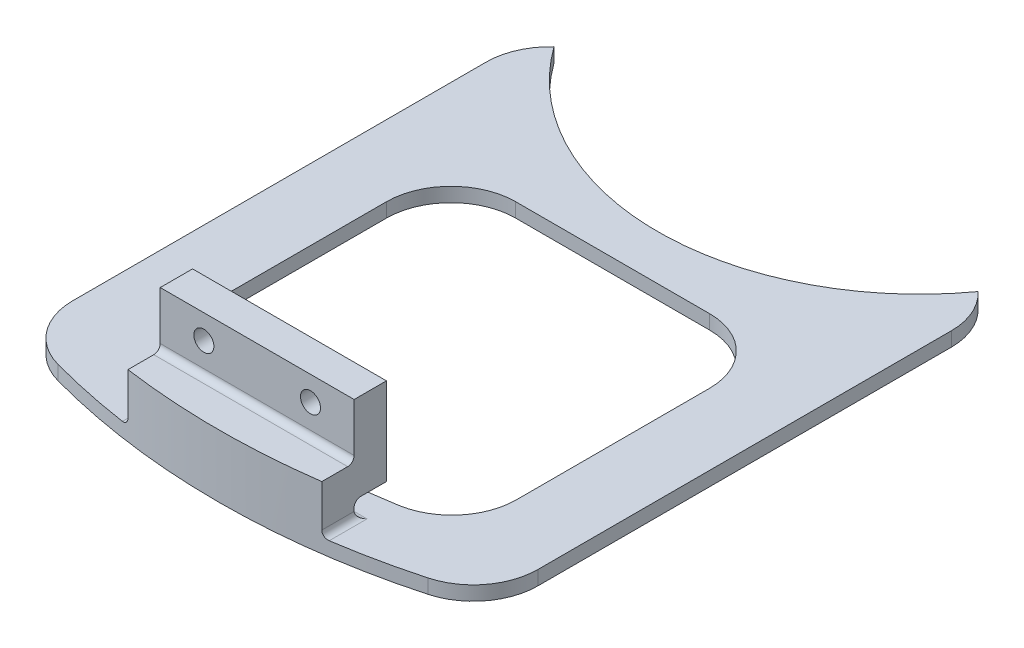
ISO-10303-21;
HEADER;
FILE_DESCRIPTION(('STEP AP214'),'2;1');
FILE_NAME('part.step','',(''),(''),'','','');
FILE_SCHEMA(('AUTOMOTIVE_DESIGN { 1 0 10303 214 1 1 1 1 }'));
ENDSEC;
DATA;
#1=APPLICATION_CONTEXT('core data for automotive mechanical design processes');
#2=APPLICATION_PROTOCOL_DEFINITION('international standard','automotive_design',2000,#1);
#3=PRODUCT_CONTEXT('',#1,'mechanical');
#4=PRODUCT('Part','Part','',(#3));
#5=PRODUCT_RELATED_PRODUCT_CATEGORY('part','',(#4));
#6=PRODUCT_DEFINITION_FORMATION('','',#4);
#7=PRODUCT_DEFINITION_CONTEXT('part definition',#1,'design');
#8=PRODUCT_DEFINITION('design','',#6,#7);
#9=PRODUCT_DEFINITION_SHAPE('','',#8);
#10=(LENGTH_UNIT() NAMED_UNIT(*) SI_UNIT(.MILLI.,.METRE.));
#11=(NAMED_UNIT(*) PLANE_ANGLE_UNIT() SI_UNIT($,.RADIAN.));
#12=(NAMED_UNIT(*) SI_UNIT($,.STERADIAN.) SOLID_ANGLE_UNIT());
#13=UNCERTAINTY_MEASURE_WITH_UNIT(LENGTH_MEASURE(1.E-05),#10,'distance_accuracy_value','');
#14=(GEOMETRIC_REPRESENTATION_CONTEXT(3) GLOBAL_UNCERTAINTY_ASSIGNED_CONTEXT((#13)) GLOBAL_UNIT_ASSIGNED_CONTEXT((#10,
#11,#12)) REPRESENTATION_CONTEXT('',''));
#15=CARTESIAN_POINT('',(0.,0.,0.));
#16=DIRECTION('',(0.,0.,1.));
#17=DIRECTION('',(1.,0.,0.));
#18=AXIS2_PLACEMENT_3D('',#15,#16,#17);
#19=CARTESIAN_POINT('',(8.25,-9.25,-97.48));
#20=DIRECTION('',(0.,-1.,0.));
#21=DIRECTION('',(0.,0.,-1.));
#22=AXIS2_PLACEMENT_3D('',#19,#20,#21);
#23=CYLINDRICAL_SURFACE('',#22,108.521658667752);
#24=CARTESIAN_POINT('',(8.25,-9.25,-97.48));
#25=DIRECTION('',(0.,-1.,0.));
#26=DIRECTION('',(0.,0.,-1.));
#27=AXIS2_PLACEMENT_3D('',#24,#25,#26);
#28=CIRCLE('',#27,108.521658667752);
#29=CARTESIAN_POINT('',(-7.75,-9.25,9.85569024327362));
#30=VERTEX_POINT('',#29);
#31=CARTESIAN_POINT('',(-20.3875682307191,-9.25,7.19492577418382));
#32=VERTEX_POINT('',#31);
#33=EDGE_CURVE('E268',#30,#32,#28,.T.);
#34=ORIENTED_EDGE('',*,*,#33,.T.);
#35=DIRECTION('',(0.,-1.,0.));
#36=VECTOR('',#35,1.);
#37=CARTESIAN_POINT('',(-20.3875682307191,-9.25,7.19492577418385));
#38=LINE('',#37,#36);
#39=CARTESIAN_POINT('',(-20.3875682307191,-11.45,7.19492577418382));
#40=VERTEX_POINT('',#39);
#41=EDGE_CURVE('E429',#32,#40,#38,.T.);
#42=ORIENTED_EDGE('',*,*,#41,.T.);
#43=CARTESIAN_POINT('',(8.25,-11.45,-97.48));
#44=DIRECTION('',(0.,-1.,0.));
#45=DIRECTION('',(0.,0.,-1.));
#46=AXIS2_PLACEMENT_3D('',#43,#44,#45);
#47=CIRCLE('',#46,108.521658667752);
#48=CARTESIAN_POINT('',(36.887568230719,-11.45,7.19492577418385));
#49=VERTEX_POINT('',#48);
#50=EDGE_CURVE('E258',#49,#40,#47,.T.);
#51=ORIENTED_EDGE('',*,*,#50,.F.);
#52=DIRECTION('',(0.,-1.,0.));
#53=VECTOR('',#52,1.);
#54=CARTESIAN_POINT('',(36.887568230719,-9.25,7.19492577418385));
#55=LINE('',#54,#53);
#56=CARTESIAN_POINT('',(36.887568230719,-9.25,7.19492577418385));
#57=VERTEX_POINT('',#56);
#58=EDGE_CURVE('E427',#49,#57,#55,.F.);
#59=ORIENTED_EDGE('',*,*,#58,.T.);
#60=CARTESIAN_POINT('',(24.25,-9.25,9.85569024327364));
#61=VERTEX_POINT('',#60);
#62=EDGE_CURVE('E265',#57,#61,#28,.T.);
#63=ORIENTED_EDGE('',*,*,#62,.T.);
#64=CARTESIAN_POINT('',(24.25,-9.25,9.85569024327364));
#65=CARTESIAN_POINT('',(24.2216633227259,-9.24999964339574,9.8599143150362));
#66=CARTESIAN_POINT('',(24.1933383876985,-9.24879480217106,9.86412502392636));
#67=CARTESIAN_POINT('',(24.1368858122979,-9.24398621382035,9.87249448224565));
#68=CARTESIAN_POINT('',(24.1087581679046,-9.24038251572121,9.8766532327349));
#69=CARTESIAN_POINT('',(24.0250038254511,-9.22600081021664,9.88900309035678));
#70=CARTESIAN_POINT('',(23.9699300760957,-9.21165212940956,9.89707907575636));
#71=CARTESIAN_POINT('',(23.8629333855757,-9.17379976489967,9.91268897203966));
#72=CARTESIAN_POINT('',(23.8110124046851,-9.15029045148022,9.92022254620202));
#73=CARTESIAN_POINT('',(23.7118390084713,-9.09475414414218,9.93454484704541));
#74=CARTESIAN_POINT('',(23.664585300504,-9.06272951774119,9.94133378001955));
#75=CARTESIAN_POINT('',(23.5763773146324,-8.9912411869201,9.9539543036151));
#76=CARTESIAN_POINT('',(23.5353899379214,-8.95181920628776,9.95979093613669));
#77=CARTESIAN_POINT('',(23.4606143267098,-8.86651187037467,9.97040270678705));
#78=CARTESIAN_POINT('',(23.4268273713199,-8.82062536911251,9.97517765632089));
#79=CARTESIAN_POINT('',(23.3677761168279,-8.72418227142505,9.98350138184809));
#80=CARTESIAN_POINT('',(23.342432608048,-8.67367509381844,9.98706156195158));
#81=CARTESIAN_POINT('',(23.3005987139787,-8.56906802196801,9.99292834865943));
#82=CARTESIAN_POINT('',(23.2841018986807,-8.51497076931056,9.99523586574712));
#83=CARTESIAN_POINT('',(23.2648712972298,-8.42540918819503,9.99792375532438));
#84=CARTESIAN_POINT('',(23.259297802299,-8.39054067073665,9.99870209165019));
#85=CARTESIAN_POINT('',(23.2518629545497,-8.32045332014802,9.9997400084942));
#86=CARTESIAN_POINT('',(23.2499962744671,-8.28523506296323,10.0000003334756));
#87=CARTESIAN_POINT('',(23.25,-8.25,9.99999999999993));
#88=B_SPLINE_CURVE_WITH_KNOTS('',3,(#64,#65,#66,#67,#68,#69,#70,#71,#72,#73,#74,#75,#76,#77,#78,
#79,#80,#81,#82,#83,#84,#85,#86,#87),.UNSPECIFIED.,.F.,.F.,(4,2,2,2,2,2,2,2,2,2,2,4),(0.,
0.0858969513590906,0.171792147244589,0.343356011096066,0.515025477166277,0.686647263688091,
0.857328652532093,1.02804033664651,1.19710221555896,1.3660410487506,1.47181520081828,
1.57743722879529),.UNSPECIFIED.);
#89=CARTESIAN_POINT('',(23.25,-8.25,9.99999999999994));
#90=VERTEX_POINT('',#89);
#91=EDGE_CURVE('E254',#61,#90,#88,.T.);
#92=ORIENTED_EDGE('',*,*,#91,.T.);
#93=DIRECTION('',(0.,-1.,0.));
#94=VECTOR('',#93,1.);
#95=CARTESIAN_POINT('',(23.25,6.75,9.99999999999994));
#96=LINE('',#95,#94);
#97=CARTESIAN_POINT('',(23.25,-1.75,9.99999999999994));
#98=VERTEX_POINT('',#97);
#99=EDGE_CURVE('E246',#98,#90,#96,.T.);
#100=ORIENTED_EDGE('',*,*,#99,.F.);
#101=CARTESIAN_POINT('',(8.25,-1.75,-97.48));
#102=DIRECTION('',(0.,1.,0.));
#103=DIRECTION('',(0.,0.,1.));
#104=AXIS2_PLACEMENT_3D('',#101,#102,#103);
#105=CIRCLE('',#104,108.521658667752);
#106=CARTESIAN_POINT('',(-6.75,-1.75,9.99999999999994));
#107=VERTEX_POINT('',#106);
#108=EDGE_CURVE('E228',#107,#98,#105,.T.);
#109=ORIENTED_EDGE('',*,*,#108,.F.);
#110=DIRECTION('',(0.,-1.,0.));
#111=VECTOR('',#110,1.);
#112=CARTESIAN_POINT('',(-6.74999999999996,6.75,9.99999999999994));
#113=LINE('',#112,#111);
#114=CARTESIAN_POINT('',(-6.74999999999996,-8.25,9.99999999999994));
#115=VERTEX_POINT('',#114);
#116=EDGE_CURVE('E255',#107,#115,#113,.T.);
#117=ORIENTED_EDGE('',*,*,#116,.T.);
#118=CARTESIAN_POINT('',(-6.75,-8.25,9.99999999999994));
#119=CARTESIAN_POINT('',(-6.75000004412875,-8.27793471444524,9.99999993044697));
#120=CARTESIAN_POINT('',(-6.75117126927285,-8.30585598158707,9.99983654352313));
#121=CARTESIAN_POINT('',(-6.75584280917468,-8.36149728666654,9.99918444907749));
#122=CARTESIAN_POINT('',(-6.75934297019445,-8.38921733776479,9.99869576302937));
#123=CARTESIAN_POINT('',(-6.77329941928926,-8.47171473536714,9.99674617627901));
#124=CARTESIAN_POINT('',(-6.78721179104062,-8.52593716949309,9.99480173440927));
#125=CARTESIAN_POINT('',(-6.82384495046801,-8.63124877844802,9.98966984349903));
#126=CARTESIAN_POINT('',(-6.84656918925215,-8.68233671658209,9.98648190744956));
#127=CARTESIAN_POINT('',(-6.90015101140964,-8.7799573889968,9.97894124478609));
#128=CARTESIAN_POINT('',(-6.93100775086069,-8.82649059524234,9.97458863903098));
#129=CARTESIAN_POINT('',(-7.0000923866286,-8.91389373158154,9.96480583292145));
#130=CARTESIAN_POINT('',(-7.03834952022752,-8.9547400552399,9.95937135577042));
#131=CARTESIAN_POINT('',(-7.12105559887953,-9.02944502935275,9.94756997709562));
#132=CARTESIAN_POINT('',(-7.16550582912279,-9.06330222579659,9.94120288202105));
#133=CARTESIAN_POINT('',(-7.25976332392058,-9.12339688667354,9.9276344000384));
#134=CARTESIAN_POINT('',(-7.30961672027741,-9.14956027529432,9.92042578027308));
#135=CARTESIAN_POINT('',(-7.41291592279116,-9.19314005613772,9.90540954264948));
#136=CARTESIAN_POINT('',(-7.46636017779476,-9.21056019800932,9.89760218322698));
#137=CARTESIAN_POINT('',(-7.55839251930446,-9.23223140365304,9.88408416918581));
#138=CARTESIAN_POINT('',(-7.59644659984373,-9.23889124899092,9.87847433747389));
#139=CARTESIAN_POINT('',(-7.67299677992648,-9.24777521555385,9.86714754349608));
#140=CARTESIAN_POINT('',(-7.71149216767686,-9.25000568138885,9.86143074632082));
#141=CARTESIAN_POINT('',(-7.75,-9.25,9.85569024327364));
#142=B_SPLINE_CURVE_WITH_KNOTS('',3,(#118,#119,#120,#121,#122,#123,#124,#125,#126,#127,#128,
#129,#130,#131,#132,#133,#134,#135,#136,#137,#138,#139,#140,#141),.UNSPECIFIED.,.F.,.F.,(4,2,2,
2,2,2,2,2,2,2,2,4),(0.,0.0837524462378463,0.167499364348996,0.334673806111854,0.501913786847974,
0.669136419658965,0.837033726521106,1.00496592743846,1.17446567822654,1.34389267471377,
1.46076557126968,1.57747093886661),.UNSPECIFIED.);
#143=EDGE_CURVE('E348',#115,#30,#142,.T.);
#144=ORIENTED_EDGE('',*,*,#143,.T.);
#145=EDGE_LOOP('',(#34,#42,#51,#59,#63,#92,#100,#109,#117,#144));
#146=FACE_BOUND('',#145,.T.);
#147=ADVANCED_FACE('F41',(#146),#23,.T.);
#148=CARTESIAN_POINT('',(-6.75,6.75,5.));
#149=DIRECTION('',(0.,0.,1.));
#150=DIRECTION('',(1.,0.,0.));
#151=AXIS2_PLACEMENT_3D('',#148,#149,#150);
#152=PLANE('',#151);
#153=DIRECTION('',(0.,-1.,0.));
#154=VECTOR('',#153,1.);
#155=CARTESIAN_POINT('',(-6.75,6.75,5.));
#156=LINE('',#155,#154);
#157=CARTESIAN_POINT('',(-6.75,-7.75,5.));
#158=VERTEX_POINT('',#157);
#159=CARTESIAN_POINT('',(-6.75,-8.25,5.));
#160=VERTEX_POINT('',#159);
#161=EDGE_CURVE('E261',#158,#160,#156,.T.);
#162=ORIENTED_EDGE('',*,*,#161,.F.);
#163=DIRECTION('',(-1.,0.,0.));
#164=VECTOR('',#163,1.);
#165=CARTESIAN_POINT('',(23.25,-7.75,5.));
#166=LINE('',#165,#164);
#167=CARTESIAN_POINT('',(23.25,-7.75,5.));
#168=VERTEX_POINT('',#167);
#169=EDGE_CURVE('E320',#158,#168,#166,.F.);
#170=ORIENTED_EDGE('',*,*,#169,.T.);
#171=DIRECTION('',(0.,-1.,0.));
#172=VECTOR('',#171,1.);
#173=CARTESIAN_POINT('',(23.25,6.75,5.));
#174=LINE('',#173,#172);
#175=CARTESIAN_POINT('',(23.25,-8.25,5.));
#176=VERTEX_POINT('',#175);
#177=EDGE_CURVE('E256',#168,#176,#174,.T.);
#178=ORIENTED_EDGE('',*,*,#177,.T.);
#179=DIRECTION('',(-1.,0.,0.));
#180=VECTOR('',#179,1.);
#181=CARTESIAN_POINT('',(-6.75,-8.25,5.));
#182=LINE('',#181,#180);
#183=EDGE_CURVE('E318',#176,#160,#182,.T.);
#184=ORIENTED_EDGE('',*,*,#183,.T.);
#185=EDGE_LOOP('',(#162,#170,#178,#184));
#186=FACE_BOUND('',#185,.T.);
#187=ADVANCED_FACE('F362',(#186),#152,.F.);
#188=CARTESIAN_POINT('',(8.25,-9.25,-97.48));
#189=DIRECTION('',(0.,-1.,0.));
#190=DIRECTION('',(0.,0.,-1.));
#191=AXIS2_PLACEMENT_3D('',#188,#189,#190);
#192=PLANE('',#191);
#193=DIRECTION('',(0.,0.,-1.));
#194=VECTOR('',#193,1.);
#195=CARTESIAN_POINT('',(33.25,-9.25,-2.07376121028556));
#196=LINE('',#195,#194);
#197=CARTESIAN_POINT('',(33.25,-9.25,-10.131251972072));
#198=VERTEX_POINT('',#197);
#199=CARTESIAN_POINT('',(33.25,-9.25,-40.));
#200=VERTEX_POINT('',#199);
#201=EDGE_CURVE('E477',#198,#200,#196,.T.);
#202=ORIENTED_EDGE('',*,*,#201,.F.);
#203=CARTESIAN_POINT('',(23.25,-9.25,-10.131251972072));
#204=DIRECTION('',(0.,-1.,0.));
#205=DIRECTION('',(0.,0.,-1.));
#206=AXIS2_PLACEMENT_3D('',#203,#204,#205);
#207=CIRCLE('',#206,10.);
#208=CARTESIAN_POINT('',(24.942480169274,-9.25,-0.275517048860321));
#209=VERTEX_POINT('',#208);
#210=EDGE_CURVE('E467',#198,#209,#207,.T.);
#211=ORIENTED_EDGE('',*,*,#210,.T.);
#212=CARTESIAN_POINT('',(8.25,-9.25,-97.48));
#213=DIRECTION('',(0.,1.,0.));
#214=DIRECTION('',(0.,0.,1.));
#215=AXIS2_PLACEMENT_3D('',#212,#213,#214);
#216=CIRCLE('',#215,98.6273308976777);
#217=CARTESIAN_POINT('',(-8.44248016927394,-9.25,-0.275517048860321));
#218=VERTEX_POINT('',#217);
#219=EDGE_CURVE('E310',#218,#209,#216,.T.);
#220=ORIENTED_EDGE('',*,*,#219,.F.);
#221=CARTESIAN_POINT('',(-6.74999999999999,-9.25,-10.131251972072));
#222=DIRECTION('',(0.,-1.,0.));
#223=DIRECTION('',(0.,0.,-1.));
#224=AXIS2_PLACEMENT_3D('',#221,#222,#223);
#225=CIRCLE('',#224,10.);
#226=CARTESIAN_POINT('',(-16.75,-9.25,-10.131251972072));
#227=VERTEX_POINT('',#226);
#228=EDGE_CURVE('E471',#218,#227,#225,.T.);
#229=ORIENTED_EDGE('',*,*,#228,.T.);
#230=DIRECTION('',(0.,0.,1.));
#231=VECTOR('',#230,1.);
#232=CARTESIAN_POINT('',(-16.75,-9.25,-50.));
#233=LINE('',#232,#231);
#234=CARTESIAN_POINT('',(-16.75,-9.25,-40.));
#235=VERTEX_POINT('',#234);
#236=EDGE_CURVE('E511',#235,#227,#233,.T.);
#237=ORIENTED_EDGE('',*,*,#236,.F.);
#238=CARTESIAN_POINT('',(-6.75,-9.25,-40.));
#239=DIRECTION('',(0.,-1.,0.));
#240=DIRECTION('',(0.,0.,-1.));
#241=AXIS2_PLACEMENT_3D('',#238,#239,#240);
#242=CIRCLE('',#241,10.);
#243=CARTESIAN_POINT('',(-6.75,-9.25,-50.));
#244=VERTEX_POINT('',#243);
#245=EDGE_CURVE('E64',#235,#244,#242,.T.);
#246=ORIENTED_EDGE('',*,*,#245,.T.);
#247=DIRECTION('',(-1.,0.,0.));
#248=VECTOR('',#247,1.);
#249=CARTESIAN_POINT('',(33.25,-9.25,-50.));
#250=LINE('',#249,#248);
#251=CARTESIAN_POINT('',(23.25,-9.25,-50.));
#252=VERTEX_POINT('',#251);
#253=EDGE_CURVE('E478',#252,#244,#250,.T.);
#254=ORIENTED_EDGE('',*,*,#253,.F.);
#255=CARTESIAN_POINT('',(23.25,-9.25,-40.));
#256=DIRECTION('',(0.,-1.,0.));
#257=DIRECTION('',(0.,0.,-1.));
#258=AXIS2_PLACEMENT_3D('',#255,#256,#257);
#259=CIRCLE('',#258,10.);
#260=EDGE_CURVE('E49',#252,#200,#259,.T.);
#261=ORIENTED_EDGE('',*,*,#260,.T.);
#262=EDGE_LOOP('',(#202,#211,#220,#229,#237,#246,#254,#261));
#263=FACE_BOUND('',#262,.T.);
#264=DIRECTION('',(0.,0.,-1.));
#265=VECTOR('',#264,1.);
#266=CARTESIAN_POINT('',(-27.748687791341,-9.25,4.89697435117693));
#267=LINE('',#266,#265);
#268=CARTESIAN_POINT('',(-27.748687791341,-9.25,-2.45060739027463));
#269=VERTEX_POINT('',#268);
#270=CARTESIAN_POINT('',(-27.748687791341,-9.25,-66.4009079535447));
#271=VERTEX_POINT('',#270);
#272=EDGE_CURVE('E267',#269,#271,#267,.T.);
#273=ORIENTED_EDGE('',*,*,#272,.F.);
#274=CARTESIAN_POINT('',(-17.748687791341,-9.25,-2.45060739027463));
#275=DIRECTION('',(0.,-1.,0.));
#276=DIRECTION('',(0.,0.,-1.));
#277=AXIS2_PLACEMENT_3D('',#274,#275,#276);
#278=CIRCLE('',#277,10.);
#279=EDGE_CURVE('E439',#269,#32,#278,.F.);
#280=ORIENTED_EDGE('',*,*,#279,.T.);
#281=ORIENTED_EDGE('',*,*,#33,.F.);
#282=DIRECTION('',(0.,0.,1.));
#283=VECTOR('',#282,1.);
#284=CARTESIAN_POINT('',(-7.75,-9.25,5.));
#285=LINE('',#284,#283);
#286=CARTESIAN_POINT('',(-7.75,-9.25,4.));
#287=VERTEX_POINT('',#286);
#288=EDGE_CURVE('E326',#30,#287,#285,.F.);
#289=ORIENTED_EDGE('',*,*,#288,.T.);
#290=DIRECTION('',(-1.,0.,0.));
#291=VECTOR('',#290,1.);
#292=CARTESIAN_POINT('',(23.25,-9.25,4.));
#293=LINE('',#292,#291);
#294=CARTESIAN_POINT('',(24.25,-9.25,4.));
#295=VERTEX_POINT('',#294);
#296=EDGE_CURVE('E324',#287,#295,#293,.F.);
#297=ORIENTED_EDGE('',*,*,#296,.T.);
#298=DIRECTION('',(0.,0.,-1.));
#299=VECTOR('',#298,1.);
#300=CARTESIAN_POINT('',(24.25,-9.25,9.99999999999994));
#301=LINE('',#300,#299);
#302=EDGE_CURVE('E328',#295,#61,#301,.F.);
#303=ORIENTED_EDGE('',*,*,#302,.T.);
#304=ORIENTED_EDGE('',*,*,#62,.F.);
#305=CARTESIAN_POINT('',(34.248687791341,-9.25,-2.45060739027461));
#306=DIRECTION('',(0.,-1.,0.));
#307=DIRECTION('',(0.,0.,-1.));
#308=AXIS2_PLACEMENT_3D('',#305,#306,#307);
#309=CIRCLE('',#308,10.);
#310=CARTESIAN_POINT('',(44.248687791341,-9.25,-2.4506073902746));
#311=VERTEX_POINT('',#310);
#312=EDGE_CURVE('E56',#57,#311,#309,.F.);
#313=ORIENTED_EDGE('',*,*,#312,.T.);
#314=DIRECTION('',(0.,0.,1.));
#315=VECTOR('',#314,1.);
#316=CARTESIAN_POINT('',(44.248687791341,-9.25,-66.4009079535447));
#317=LINE('',#316,#315);
#318=CARTESIAN_POINT('',(44.2486877913411,-9.25,-66.4009079535447));
#319=VERTEX_POINT('',#318);
#320=EDGE_CURVE('E279',#319,#311,#317,.T.);
#321=ORIENTED_EDGE('',*,*,#320,.F.);
#322=CARTESIAN_POINT('',(34.2486877913411,-9.25,-66.4009079535447));
#323=DIRECTION('',(0.,-1.,0.));
#324=DIRECTION('',(0.,0.,-1.));
#325=AXIS2_PLACEMENT_3D('',#322,#323,#324);
#326=CIRCLE('',#325,10.);
#327=CARTESIAN_POINT('',(41.0539523687772,-9.25,-73.7281430412905));
#328=VERTEX_POINT('',#327);
#329=EDGE_CURVE('E276',#328,#319,#326,.T.);
#330=ORIENTED_EDGE('',*,*,#329,.F.);
#331=CARTESIAN_POINT('',(8.25,-9.25,-97.48));
#332=DIRECTION('',(0.,1.,0.));
#333=DIRECTION('',(0.,0.,1.));
#334=AXIS2_PLACEMENT_3D('',#331,#332,#333);
#335=CIRCLE('',#334,40.5);
#336=CARTESIAN_POINT('',(-24.5539523687772,-9.25,-73.7281430412905));
#337=VERTEX_POINT('',#336);
#338=EDGE_CURVE('E273',#337,#328,#335,.T.);
#339=ORIENTED_EDGE('',*,*,#338,.F.);
#340=CARTESIAN_POINT('',(-17.748687791341,-9.25,-66.4009079535447));
#341=DIRECTION('',(0.,-1.,0.));
#342=DIRECTION('',(0.,0.,-1.));
#343=AXIS2_PLACEMENT_3D('',#340,#341,#342);
#344=CIRCLE('',#343,9.99999999999999);
#345=EDGE_CURVE('E270',#271,#337,#344,.T.);
#346=ORIENTED_EDGE('',*,*,#345,.F.);
#347=EDGE_LOOP('',(#273,#280,#281,#289,#297,#303,#304,#313,#321,#330,#339,#346));
#348=FACE_BOUND('',#347,.T.);
#349=ADVANCED_FACE('F476',(#263,#348),#192,.F.);
#350=CARTESIAN_POINT('',(44.248687791341,-9.25,-66.4009079535447));
#351=DIRECTION('',(1.,0.,0.));
#352=DIRECTION('',(0.,0.,-1.));
#353=AXIS2_PLACEMENT_3D('',#350,#351,#352);
#354=PLANE('',#353);
#355=ORIENTED_EDGE('',*,*,#320,.T.);
#356=DIRECTION('',(0.,-1.,0.));
#357=VECTOR('',#356,1.);
#358=CARTESIAN_POINT('',(44.248687791341,-9.25,-2.4506073902746));
#359=LINE('',#358,#357);
#360=CARTESIAN_POINT('',(44.248687791341,-11.45,-2.4506073902746));
#361=VERTEX_POINT('',#360);
#362=EDGE_CURVE('E441',#311,#361,#359,.T.);
#363=ORIENTED_EDGE('',*,*,#362,.T.);
#364=DIRECTION('',(0.,0.,1.));
#365=VECTOR('',#364,1.);
#366=CARTESIAN_POINT('',(44.248687791341,-11.45,-66.4009079535447));
#367=LINE('',#366,#365);
#368=CARTESIAN_POINT('',(44.2486877913411,-11.45,-66.4009079535447));
#369=VERTEX_POINT('',#368);
#370=EDGE_CURVE('E295',#369,#361,#367,.T.);
#371=ORIENTED_EDGE('',*,*,#370,.F.);
#372=DIRECTION('',(0.,-1.,0.));
#373=VECTOR('',#372,1.);
#374=CARTESIAN_POINT('',(44.2486877913411,-9.25,-66.4009079535447));
#375=LINE('',#374,#373);
#376=EDGE_CURVE('E298',#319,#369,#375,.T.);
#377=ORIENTED_EDGE('',*,*,#376,.F.);
#378=EDGE_LOOP('',(#355,#363,#371,#377));
#379=FACE_BOUND('',#378,.T.);
#380=ADVANCED_FACE('F557',(#379),#354,.T.);
#381=CARTESIAN_POINT('',(34.2486877913411,-9.25,-66.4009079535447));
#382=DIRECTION('',(0.,-1.,0.));
#383=DIRECTION('',(0.,0.,-1.));
#384=AXIS2_PLACEMENT_3D('',#381,#382,#383);
#385=CYLINDRICAL_SURFACE('',#384,10.);
#386=CARTESIAN_POINT('',(34.2486877913411,-11.45,-66.4009079535447));
#387=DIRECTION('',(0.,-1.,0.));
#388=DIRECTION('',(0.,0.,-1.));
#389=AXIS2_PLACEMENT_3D('',#386,#387,#388);
#390=CIRCLE('',#389,10.);
#391=CARTESIAN_POINT('',(41.0539523687772,-11.45,-73.7281430412905));
#392=VERTEX_POINT('',#391);
#393=EDGE_CURVE('E292',#392,#369,#390,.T.);
#394=ORIENTED_EDGE('',*,*,#393,.F.);
#395=DIRECTION('',(0.,-1.,0.));
#396=VECTOR('',#395,1.);
#397=CARTESIAN_POINT('',(41.0539523687772,-9.25,-73.7281430412905));
#398=LINE('',#397,#396);
#399=EDGE_CURVE('E301',#328,#392,#398,.T.);
#400=ORIENTED_EDGE('',*,*,#399,.F.);
#401=ORIENTED_EDGE('',*,*,#329,.T.);
#402=ORIENTED_EDGE('',*,*,#376,.T.);
#403=EDGE_LOOP('',(#394,#400,#401,#402));
#404=FACE_BOUND('',#403,.T.);
#405=ADVANCED_FACE('F570',(#404),#385,.T.);
#406=CARTESIAN_POINT('',(8.25,-9.25,-97.48));
#407=DIRECTION('',(0.,-1.,0.));
#408=DIRECTION('',(0.,0.,-1.));
#409=AXIS2_PLACEMENT_3D('',#406,#407,#408);
#410=CYLINDRICAL_SURFACE('',#409,40.5);
#411=CARTESIAN_POINT('',(8.25,-11.45,-97.48));
#412=DIRECTION('',(0.,1.,0.));
#413=DIRECTION('',(0.,0.,1.));
#414=AXIS2_PLACEMENT_3D('',#411,#412,#413);
#415=CIRCLE('',#414,40.5);
#416=CARTESIAN_POINT('',(-24.5539523687772,-11.45,-73.7281430412905));
#417=VERTEX_POINT('',#416);
#418=EDGE_CURVE('E289',#417,#392,#415,.T.);
#419=ORIENTED_EDGE('',*,*,#418,.F.);
#420=DIRECTION('',(0.,-1.,0.));
#421=VECTOR('',#420,1.);
#422=CARTESIAN_POINT('',(-24.5539523687772,-9.25,-73.7281430412905));
#423=LINE('',#422,#421);
#424=EDGE_CURVE('E303',#337,#417,#423,.T.);
#425=ORIENTED_EDGE('',*,*,#424,.F.);
#426=ORIENTED_EDGE('',*,*,#338,.T.);
#427=ORIENTED_EDGE('',*,*,#399,.T.);
#428=EDGE_LOOP('',(#419,#425,#426,#427));
#429=FACE_BOUND('',#428,.T.);
#430=ADVANCED_FACE('F563',(#429),#410,.F.);
#431=CARTESIAN_POINT('',(-17.748687791341,-9.25,-66.4009079535447));
#432=DIRECTION('',(0.,-1.,0.));
#433=DIRECTION('',(0.,0.,-1.));
#434=AXIS2_PLACEMENT_3D('',#431,#432,#433);
#435=CYLINDRICAL_SURFACE('',#434,9.99999999999999);
#436=CARTESIAN_POINT('',(-17.748687791341,-11.45,-66.4009079535447));
#437=DIRECTION('',(0.,-1.,0.));
#438=DIRECTION('',(0.,0.,-1.));
#439=AXIS2_PLACEMENT_3D('',#436,#437,#438);
#440=CIRCLE('',#439,9.99999999999999);
#441=CARTESIAN_POINT('',(-27.748687791341,-11.45,-66.4009079535447));
#442=VERTEX_POINT('',#441);
#443=EDGE_CURVE('E286',#442,#417,#440,.T.);
#444=ORIENTED_EDGE('',*,*,#443,.F.);
#445=DIRECTION('',(0.,-1.,0.));
#446=VECTOR('',#445,1.);
#447=CARTESIAN_POINT('',(-27.748687791341,-9.25,-66.4009079535447));
#448=LINE('',#447,#446);
#449=EDGE_CURVE('E281',#271,#442,#448,.T.);
#450=ORIENTED_EDGE('',*,*,#449,.F.);
#451=ORIENTED_EDGE('',*,*,#345,.T.);
#452=ORIENTED_EDGE('',*,*,#424,.T.);
#453=EDGE_LOOP('',(#444,#450,#451,#452));
#454=FACE_BOUND('',#453,.T.);
#455=ADVANCED_FACE('F567',(#454),#435,.T.);
#456=CARTESIAN_POINT('',(-27.748687791341,-9.25,4.89697435117693));
#457=DIRECTION('',(-1.,0.,0.));
#458=DIRECTION('',(0.,0.,1.));
#459=AXIS2_PLACEMENT_3D('',#456,#457,#458);
#460=PLANE('',#459);
#461=DIRECTION('',(0.,0.,-1.));
#462=VECTOR('',#461,1.);
#463=CARTESIAN_POINT('',(-27.748687791341,-11.45,4.89697435117693));
#464=LINE('',#463,#462);
#465=CARTESIAN_POINT('',(-27.748687791341,-11.45,-2.45060739027463));
#466=VERTEX_POINT('',#465);
#467=EDGE_CURVE('E284',#466,#442,#464,.T.);
#468=ORIENTED_EDGE('',*,*,#467,.F.);
#469=DIRECTION('',(0.,-1.,0.));
#470=VECTOR('',#469,1.);
#471=CARTESIAN_POINT('',(-27.748687791341,-9.25,-2.45060739027463));
#472=LINE('',#471,#470);
#473=EDGE_CURVE('E436',#466,#269,#472,.F.);
#474=ORIENTED_EDGE('',*,*,#473,.T.);
#475=ORIENTED_EDGE('',*,*,#272,.T.);
#476=ORIENTED_EDGE('',*,*,#449,.T.);
#477=EDGE_LOOP('',(#468,#474,#475,#476));
#478=FACE_BOUND('',#477,.T.);
#479=ADVANCED_FACE('F363',(#478),#460,.T.);
#480=CARTESIAN_POINT('',(8.25,-11.45,-97.48));
#481=DIRECTION('',(0.,-1.,0.));
#482=DIRECTION('',(0.,0.,-1.));
#483=AXIS2_PLACEMENT_3D('',#480,#481,#482);
#484=PLANE('',#483);
#485=DIRECTION('',(0.,0.,1.));
#486=VECTOR('',#485,1.);
#487=CARTESIAN_POINT('',(-16.75,-11.45,-50.));
#488=LINE('',#487,#486);
#489=CARTESIAN_POINT('',(-16.75,-11.45,-40.));
#490=VERTEX_POINT('',#489);
#491=CARTESIAN_POINT('',(-16.75,-11.45,-10.131251972072));
#492=VERTEX_POINT('',#491);
#493=EDGE_CURVE('E501',#490,#492,#488,.T.);
#494=ORIENTED_EDGE('',*,*,#493,.T.);
#495=CARTESIAN_POINT('',(-6.74999999999999,-11.45,-10.131251972072));
#496=DIRECTION('',(0.,-1.,0.));
#497=DIRECTION('',(0.,0.,-1.));
#498=AXIS2_PLACEMENT_3D('',#495,#496,#497);
#499=CIRCLE('',#498,10.);
#500=CARTESIAN_POINT('',(-8.44248016927394,-11.45,-0.275517048860321));
#501=VERTEX_POINT('',#500);
#502=EDGE_CURVE('E473',#492,#501,#499,.F.);
#503=ORIENTED_EDGE('',*,*,#502,.T.);
#504=CARTESIAN_POINT('',(8.25,-11.45,-97.48));
#505=DIRECTION('',(0.,1.,0.));
#506=DIRECTION('',(0.,0.,1.));
#507=AXIS2_PLACEMENT_3D('',#504,#505,#506);
#508=CIRCLE('',#507,98.6273308976777);
#509=CARTESIAN_POINT('',(24.942480169274,-11.45,-0.275517048860321));
#510=VERTEX_POINT('',#509);
#511=EDGE_CURVE('E504',#501,#510,#508,.T.);
#512=ORIENTED_EDGE('',*,*,#511,.T.);
#513=CARTESIAN_POINT('',(23.25,-11.45,-10.131251972072));
#514=DIRECTION('',(0.,-1.,0.));
#515=DIRECTION('',(0.,0.,-1.));
#516=AXIS2_PLACEMENT_3D('',#513,#514,#515);
#517=CIRCLE('',#516,10.);
#518=CARTESIAN_POINT('',(33.25,-11.45,-10.131251972072));
#519=VERTEX_POINT('',#518);
#520=EDGE_CURVE('E469',#510,#519,#517,.F.);
#521=ORIENTED_EDGE('',*,*,#520,.T.);
#522=DIRECTION('',(0.,0.,-1.));
#523=VECTOR('',#522,1.);
#524=CARTESIAN_POINT('',(33.25,-11.45,-2.07376121028556));
#525=LINE('',#524,#523);
#526=CARTESIAN_POINT('',(33.25,-11.45,-40.));
#527=VERTEX_POINT('',#526);
#528=EDGE_CURVE('E497',#519,#527,#525,.T.);
#529=ORIENTED_EDGE('',*,*,#528,.T.);
#530=CARTESIAN_POINT('',(23.25,-11.45,-40.));
#531=DIRECTION('',(0.,-1.,0.));
#532=DIRECTION('',(0.,0.,-1.));
#533=AXIS2_PLACEMENT_3D('',#530,#531,#532);
#534=CIRCLE('',#533,10.);
#535=CARTESIAN_POINT('',(23.25,-11.45,-50.));
#536=VERTEX_POINT('',#535);
#537=EDGE_CURVE('E11',#527,#536,#534,.F.);
#538=ORIENTED_EDGE('',*,*,#537,.T.);
#539=DIRECTION('',(-1.,0.,0.));
#540=VECTOR('',#539,1.);
#541=CARTESIAN_POINT('',(33.25,-11.45,-50.));
#542=LINE('',#541,#540);
#543=CARTESIAN_POINT('',(-6.75,-11.45,-50.));
#544=VERTEX_POINT('',#543);
#545=EDGE_CURVE('E495',#536,#544,#542,.T.);
#546=ORIENTED_EDGE('',*,*,#545,.T.);
#547=CARTESIAN_POINT('',(-6.75,-11.45,-40.));
#548=DIRECTION('',(0.,-1.,0.));
#549=DIRECTION('',(0.,0.,-1.));
#550=AXIS2_PLACEMENT_3D('',#547,#548,#549);
#551=CIRCLE('',#550,10.);
#552=EDGE_CURVE('E465',#544,#490,#551,.F.);
#553=ORIENTED_EDGE('',*,*,#552,.T.);
#554=EDGE_LOOP('',(#494,#503,#512,#521,#529,#538,#546,#553));
#555=FACE_BOUND('',#554,.T.);
#556=ORIENTED_EDGE('',*,*,#50,.T.);
#557=CARTESIAN_POINT('',(-17.748687791341,-11.45,-2.45060739027463));
#558=DIRECTION('',(0.,-1.,0.));
#559=DIRECTION('',(0.,0.,-1.));
#560=AXIS2_PLACEMENT_3D('',#557,#558,#559);
#561=CIRCLE('',#560,10.);
#562=EDGE_CURVE('E434',#40,#466,#561,.T.);
#563=ORIENTED_EDGE('',*,*,#562,.T.);
#564=ORIENTED_EDGE('',*,*,#467,.T.);
#565=ORIENTED_EDGE('',*,*,#443,.T.);
#566=ORIENTED_EDGE('',*,*,#418,.T.);
#567=ORIENTED_EDGE('',*,*,#393,.T.);
#568=ORIENTED_EDGE('',*,*,#370,.T.);
#569=CARTESIAN_POINT('',(34.248687791341,-11.45,-2.45060739027461));
#570=DIRECTION('',(0.,-1.,0.));
#571=DIRECTION('',(0.,0.,-1.));
#572=AXIS2_PLACEMENT_3D('',#569,#570,#571);
#573=CIRCLE('',#572,10.);
#574=EDGE_CURVE('E432',#361,#49,#573,.T.);
#575=ORIENTED_EDGE('',*,*,#574,.T.);
#576=EDGE_LOOP('',(#556,#563,#564,#565,#566,#567,#568,#575));
#577=FACE_BOUND('',#576,.T.);
#578=ADVANCED_FACE('F493',(#555,#577),#484,.T.);
#579=CARTESIAN_POINT('',(-6.75,6.75,9.99999999999994));
#580=DIRECTION('',(1.,0.,0.));
#581=DIRECTION('',(0.,0.,-1.));
#582=AXIS2_PLACEMENT_3D('',#579,#580,#581);
#583=PLANE('',#582);
#584=ORIENTED_EDGE('',*,*,#161,.T.);
#585=DIRECTION('',(0.,0.,1.));
#586=VECTOR('',#585,1.);
#587=CARTESIAN_POINT('',(-6.75,-8.25,9.99999999999993));
#588=LINE('',#587,#586);
#589=EDGE_CURVE('E331',#160,#115,#588,.T.);
#590=ORIENTED_EDGE('',*,*,#589,.T.);
#591=ORIENTED_EDGE('',*,*,#116,.F.);
#592=DIRECTION('',(0.,0.,1.));
#593=VECTOR('',#592,1.);
#594=CARTESIAN_POINT('',(-6.75,-1.75,5.));
#595=LINE('',#594,#593);
#596=CARTESIAN_POINT('',(-6.75,-1.75,6.00000000000001));
#597=VERTEX_POINT('',#596);
#598=EDGE_CURVE('E235',#597,#107,#595,.T.);
#599=ORIENTED_EDGE('',*,*,#598,.F.);
#600=CARTESIAN_POINT('',(-6.75,-0.749999999999996,6.00000000000001));
#601=DIRECTION('',(1.,0.,0.));
#602=DIRECTION('',(0.,0.,-1.));
#603=AXIS2_PLACEMENT_3D('',#600,#601,#602);
#604=CIRCLE('',#603,1.);
#605=CARTESIAN_POINT('',(-6.75,-0.749999999999996,5.));
#606=VERTEX_POINT('',#605);
#607=EDGE_CURVE('E539',#597,#606,#604,.T.);
#608=ORIENTED_EDGE('',*,*,#607,.T.);
#609=DIRECTION('',(0.,1.,0.));
#610=VECTOR('',#609,1.);
#611=CARTESIAN_POINT('',(-6.75,-1.75,5.));
#612=LINE('',#611,#610);
#613=CARTESIAN_POINT('',(-6.75,6.75,5.));
#614=VERTEX_POINT('',#613);
#615=EDGE_CURVE('E518',#606,#614,#612,.T.);
#616=ORIENTED_EDGE('',*,*,#615,.T.);
#617=DIRECTION('',(0.,0.,1.));
#618=VECTOR('',#617,1.);
#619=CARTESIAN_POINT('',(-6.75,6.75,9.99999999999994));
#620=LINE('',#619,#618);
#621=CARTESIAN_POINT('',(-6.75,6.75,0.));
#622=VERTEX_POINT('',#621);
#623=EDGE_CURVE('E395',#622,#614,#620,.T.);
#624=ORIENTED_EDGE('',*,*,#623,.F.);
#625=DIRECTION('',(0.,1.,0.));
#626=VECTOR('',#625,1.);
#627=CARTESIAN_POINT('',(-6.75,6.75,0.));
#628=LINE('',#627,#626);
#629=CARTESIAN_POINT('',(-6.75,-6.75,0.));
#630=VERTEX_POINT('',#629);
#631=EDGE_CURVE('E401',#630,#622,#628,.T.);
#632=ORIENTED_EDGE('',*,*,#631,.F.);
#633=DIRECTION('',(0.,0.,1.));
#634=VECTOR('',#633,1.);
#635=CARTESIAN_POINT('',(-6.75,-6.75,0.));
#636=LINE('',#635,#634);
#637=CARTESIAN_POINT('',(-6.75,-6.75,4.));
#638=VERTEX_POINT('',#637);
#639=EDGE_CURVE('E396',#630,#638,#636,.T.);
#640=ORIENTED_EDGE('',*,*,#639,.T.);
#641=CARTESIAN_POINT('',(-6.75,-7.75,4.));
#642=DIRECTION('',(1.,0.,0.));
#643=DIRECTION('',(0.,0.,-1.));
#644=AXIS2_PLACEMENT_3D('',#641,#642,#643);
#645=CIRCLE('',#644,1.);
#646=EDGE_CURVE('E337',#638,#158,#645,.T.);
#647=ORIENTED_EDGE('',*,*,#646,.T.);
#648=EDGE_LOOP('',(#584,#590,#591,#599,#608,#616,#624,#632,#640,#647));
#649=FACE_BOUND('',#648,.T.);
#650=ADVANCED_FACE('F409',(#649),#583,.F.);
#651=CARTESIAN_POINT('',(23.25,6.75,5.));
#652=DIRECTION('',(-1.,0.,0.));
#653=DIRECTION('',(0.,0.,1.));
#654=AXIS2_PLACEMENT_3D('',#651,#652,#653);
#655=PLANE('',#654);
#656=ORIENTED_EDGE('',*,*,#99,.T.);
#657=DIRECTION('',(0.,0.,-1.));
#658=VECTOR('',#657,1.);
#659=CARTESIAN_POINT('',(23.25,-8.25,5.));
#660=LINE('',#659,#658);
#661=EDGE_CURVE('E322',#90,#176,#660,.T.);
#662=ORIENTED_EDGE('',*,*,#661,.T.);
#663=ORIENTED_EDGE('',*,*,#177,.F.);
#664=CARTESIAN_POINT('',(23.25,-7.75,4.));
#665=DIRECTION('',(-1.,0.,0.));
#666=DIRECTION('',(0.,0.,1.));
#667=AXIS2_PLACEMENT_3D('',#664,#665,#666);
#668=CIRCLE('',#667,1.);
#669=CARTESIAN_POINT('',(23.25,-6.75,4.));
#670=VERTEX_POINT('',#669);
#671=EDGE_CURVE('E339',#168,#670,#668,.T.);
#672=ORIENTED_EDGE('',*,*,#671,.T.);
#673=DIRECTION('',(0.,0.,1.));
#674=VECTOR('',#673,1.);
#675=CARTESIAN_POINT('',(23.25,-6.75,0.));
#676=LINE('',#675,#674);
#677=CARTESIAN_POINT('',(23.25,-6.75,0.));
#678=VERTEX_POINT('',#677);
#679=EDGE_CURVE('E388',#678,#670,#676,.T.);
#680=ORIENTED_EDGE('',*,*,#679,.F.);
#681=DIRECTION('',(0.,-1.,0.));
#682=VECTOR('',#681,1.);
#683=CARTESIAN_POINT('',(23.25,-6.75,0.));
#684=LINE('',#683,#682);
#685=CARTESIAN_POINT('',(23.25,6.75,0.));
#686=VERTEX_POINT('',#685);
#687=EDGE_CURVE('E524',#686,#678,#684,.T.);
#688=ORIENTED_EDGE('',*,*,#687,.F.);
#689=DIRECTION('',(0.,0.,-1.));
#690=VECTOR('',#689,1.);
#691=CARTESIAN_POINT('',(23.25,6.75,5.));
#692=LINE('',#691,#690);
#693=CARTESIAN_POINT('',(23.25,6.75,5.));
#694=VERTEX_POINT('',#693);
#695=EDGE_CURVE('E399',#694,#686,#692,.T.);
#696=ORIENTED_EDGE('',*,*,#695,.F.);
#697=DIRECTION('',(0.,1.,0.));
#698=VECTOR('',#697,1.);
#699=CARTESIAN_POINT('',(23.25,-1.75,5.));
#700=LINE('',#699,#698);
#701=CARTESIAN_POINT('',(23.25,-0.749999999999996,5.));
#702=VERTEX_POINT('',#701);
#703=EDGE_CURVE('E515',#702,#694,#700,.T.);
#704=ORIENTED_EDGE('',*,*,#703,.F.);
#705=CARTESIAN_POINT('',(23.25,-0.749999999999996,6.00000000000001));
#706=DIRECTION('',(-1.,0.,0.));
#707=DIRECTION('',(0.,0.,1.));
#708=AXIS2_PLACEMENT_3D('',#705,#706,#707);
#709=CIRCLE('',#708,1.);
#710=CARTESIAN_POINT('',(23.25,-1.75,6.00000000000001));
#711=VERTEX_POINT('',#710);
#712=EDGE_CURVE('E250',#702,#711,#709,.T.);
#713=ORIENTED_EDGE('',*,*,#712,.T.);
#714=DIRECTION('',(0.,0.,-1.));
#715=VECTOR('',#714,1.);
#716=CARTESIAN_POINT('',(23.25,-1.75,9.99999999999994));
#717=LINE('',#716,#715);
#718=EDGE_CURVE('E232',#98,#711,#717,.T.);
#719=ORIENTED_EDGE('',*,*,#718,.F.);
#720=EDGE_LOOP('',(#656,#662,#663,#672,#680,#688,#696,#704,#713,#719));
#721=FACE_BOUND('',#720,.T.);
#722=ADVANCED_FACE('F244',(#721),#655,.F.);
#723=CARTESIAN_POINT('',(8.25,6.75,-97.48));
#724=DIRECTION('',(0.,-1.,0.));
#725=DIRECTION('',(0.,0.,-1.));
#726=AXIS2_PLACEMENT_3D('',#723,#724,#725);
#727=PLANE('',#726);
#728=ORIENTED_EDGE('',*,*,#623,.T.);
#729=DIRECTION('',(-1.,0.,0.));
#730=VECTOR('',#729,1.);
#731=CARTESIAN_POINT('',(23.25,6.75,5.));
#732=LINE('',#731,#730);
#733=EDGE_CURVE('E240',#694,#614,#732,.T.);
#734=ORIENTED_EDGE('',*,*,#733,.F.);
#735=ORIENTED_EDGE('',*,*,#695,.T.);
#736=DIRECTION('',(1.,0.,0.));
#737=VECTOR('',#736,1.);
#738=CARTESIAN_POINT('',(23.25,6.75,0.));
#739=LINE('',#738,#737);
#740=EDGE_CURVE('E520',#622,#686,#739,.T.);
#741=ORIENTED_EDGE('',*,*,#740,.F.);
#742=EDGE_LOOP('',(#728,#734,#735,#741));
#743=FACE_BOUND('',#742,.T.);
#744=ADVANCED_FACE('F532',(#743),#727,.F.);
#745=CARTESIAN_POINT('',(-6.75,-6.75,0.));
#746=DIRECTION('',(0.,1.,0.));
#747=DIRECTION('',(0.,0.,1.));
#748=AXIS2_PLACEMENT_3D('',#745,#746,#747);
#749=PLANE('',#748);
#750=ORIENTED_EDGE('',*,*,#679,.T.);
#751=DIRECTION('',(-1.,0.,0.));
#752=VECTOR('',#751,1.);
#753=CARTESIAN_POINT('',(-6.75,-6.75,4.));
#754=LINE('',#753,#752);
#755=EDGE_CURVE('E300',#670,#638,#754,.T.);
#756=ORIENTED_EDGE('',*,*,#755,.T.);
#757=ORIENTED_EDGE('',*,*,#639,.F.);
#758=DIRECTION('',(-1.,0.,0.));
#759=VECTOR('',#758,1.);
#760=CARTESIAN_POINT('',(-6.75,-6.75,0.));
#761=LINE('',#760,#759);
#762=EDGE_CURVE('E394',#678,#630,#761,.T.);
#763=ORIENTED_EDGE('',*,*,#762,.F.);
#764=EDGE_LOOP('',(#750,#756,#757,#763));
#765=FACE_BOUND('',#764,.T.);
#766=ADVANCED_FACE('F391',(#765),#749,.F.);
#767=CARTESIAN_POINT('',(0.,0.,0.));
#768=DIRECTION('',(0.,0.,1.));
#769=DIRECTION('',(1.,0.,0.));
#770=AXIS2_PLACEMENT_3D('',#767,#768,#769);
#771=PLANE('',#770);
#772=CARTESIAN_POINT('',(16.5,3.,0.));
#773=DIRECTION('',(0.,0.,-1.));
#774=DIRECTION('',(-1.,0.,0.));
#775=AXIS2_PLACEMENT_3D('',#772,#773,#774);
#776=CIRCLE('',#775,1.54999999999999);
#777=CARTESIAN_POINT('',(14.95,3.,0.));
#778=VERTEX_POINT('',#777);
#779=EDGE_CURVE('E315',#778,#778,#776,.T.);
#780=ORIENTED_EDGE('',*,*,#779,.F.);
#781=EDGE_LOOP('',(#780));
#782=FACE_BOUND('',#781,.T.);
#783=CARTESIAN_POINT('',(0.,3.,0.));
#784=DIRECTION('',(0.,0.,-1.));
#785=DIRECTION('',(-1.,0.,0.));
#786=AXIS2_PLACEMENT_3D('',#783,#784,#785);
#787=CIRCLE('',#786,1.54999999999999);
#788=CARTESIAN_POINT('',(-1.54999999999999,3.,0.));
#789=VERTEX_POINT('',#788);
#790=EDGE_CURVE('E311',#789,#789,#787,.T.);
#791=ORIENTED_EDGE('',*,*,#790,.F.);
#792=EDGE_LOOP('',(#791));
#793=FACE_BOUND('',#792,.T.);
#794=ORIENTED_EDGE('',*,*,#740,.T.);
#795=ORIENTED_EDGE('',*,*,#687,.T.);
#796=ORIENTED_EDGE('',*,*,#762,.T.);
#797=ORIENTED_EDGE('',*,*,#631,.T.);
#798=EDGE_LOOP('',(#794,#795,#796,#797));
#799=FACE_BOUND('',#798,.T.);
#800=ADVANCED_FACE('F530',(#782,#793,#799),#771,.F.);
#801=CARTESIAN_POINT('',(23.25,-1.75,5.));
#802=DIRECTION('',(0.,0.,-1.));
#803=DIRECTION('',(-1.,0.,0.));
#804=AXIS2_PLACEMENT_3D('',#801,#802,#803);
#805=PLANE('',#804);
#806=CARTESIAN_POINT('',(16.5,3.,5.));
#807=DIRECTION('',(0.,0.,-1.));
#808=DIRECTION('',(-1.,0.,0.));
#809=AXIS2_PLACEMENT_3D('',#806,#807,#808);
#810=CIRCLE('',#809,1.54999999999999);
#811=CARTESIAN_POINT('',(14.95,3.,5.));
#812=VERTEX_POINT('',#811);
#813=EDGE_CURVE('E312',#812,#812,#810,.T.);
#814=ORIENTED_EDGE('',*,*,#813,.T.);
#815=EDGE_LOOP('',(#814));
#816=FACE_BOUND('',#815,.T.);
#817=CARTESIAN_POINT('',(0.,3.,5.));
#818=DIRECTION('',(0.,0.,-1.));
#819=DIRECTION('',(-1.,0.,0.));
#820=AXIS2_PLACEMENT_3D('',#817,#818,#819);
#821=CIRCLE('',#820,1.54999999999999);
#822=CARTESIAN_POINT('',(-1.54999999999999,3.,5.));
#823=VERTEX_POINT('',#822);
#824=EDGE_CURVE('E307',#823,#823,#821,.T.);
#825=ORIENTED_EDGE('',*,*,#824,.T.);
#826=EDGE_LOOP('',(#825));
#827=FACE_BOUND('',#826,.T.);
#828=ORIENTED_EDGE('',*,*,#615,.F.);
#829=DIRECTION('',(-1.,0.,0.));
#830=VECTOR('',#829,1.);
#831=CARTESIAN_POINT('',(23.25,-0.749999999999996,5.));
#832=LINE('',#831,#830);
#833=EDGE_CURVE('E335',#606,#702,#832,.F.);
#834=ORIENTED_EDGE('',*,*,#833,.T.);
#835=ORIENTED_EDGE('',*,*,#703,.T.);
#836=ORIENTED_EDGE('',*,*,#733,.T.);
#837=EDGE_LOOP('',(#828,#834,#835,#836));
#838=FACE_BOUND('',#837,.T.);
#839=ADVANCED_FACE('F605',(#816,#827,#838),#805,.F.);
#840=CARTESIAN_POINT('',(8.25,-1.75,-97.48));
#841=DIRECTION('',(0.,1.,0.));
#842=DIRECTION('',(0.,0.,1.));
#843=AXIS2_PLACEMENT_3D('',#840,#841,#842);
#844=PLANE('',#843);
#845=ORIENTED_EDGE('',*,*,#718,.T.);
#846=DIRECTION('',(-1.,0.,0.));
#847=VECTOR('',#846,1.);
#848=CARTESIAN_POINT('',(8.25,-1.75,6.00000000000001));
#849=LINE('',#848,#847);
#850=EDGE_CURVE('E333',#711,#597,#849,.T.);
#851=ORIENTED_EDGE('',*,*,#850,.T.);
#852=ORIENTED_EDGE('',*,*,#598,.T.);
#853=ORIENTED_EDGE('',*,*,#108,.T.);
#854=EDGE_LOOP('',(#845,#851,#852,#853));
#855=FACE_BOUND('',#854,.T.);
#856=ADVANCED_FACE('F230',(#855),#844,.T.);
#857=CARTESIAN_POINT('',(8.25,-11.45,-97.48));
#858=DIRECTION('',(0.,1.,0.));
#859=DIRECTION('',(0.,0.,1.));
#860=AXIS2_PLACEMENT_3D('',#857,#858,#859);
#861=CYLINDRICAL_SURFACE('',#860,98.6273308976777);
#862=ORIENTED_EDGE('',*,*,#219,.T.);
#863=DIRECTION('',(0.,1.,0.));
#864=VECTOR('',#863,1.);
#865=CARTESIAN_POINT('',(24.942480169274,-11.45,-0.275517048860308));
#866=LINE('',#865,#864);
#867=EDGE_CURVE('E462',#209,#510,#866,.F.);
#868=ORIENTED_EDGE('',*,*,#867,.T.);
#869=ORIENTED_EDGE('',*,*,#511,.F.);
#870=DIRECTION('',(0.,1.,0.));
#871=VECTOR('',#870,1.);
#872=CARTESIAN_POINT('',(-8.44248016927395,-11.45,-0.275517048860308));
#873=LINE('',#872,#871);
#874=EDGE_CURVE('E459',#501,#218,#873,.T.);
#875=ORIENTED_EDGE('',*,*,#874,.T.);
#876=EDGE_LOOP('',(#862,#868,#869,#875));
#877=FACE_BOUND('',#876,.T.);
#878=ADVANCED_FACE('F611',(#877),#861,.F.);
#879=CARTESIAN_POINT('',(-16.75,-11.45,-50.));
#880=DIRECTION('',(-1.,0.,0.));
#881=DIRECTION('',(0.,0.,1.));
#882=AXIS2_PLACEMENT_3D('',#879,#880,#881);
#883=PLANE('',#882);
#884=ORIENTED_EDGE('',*,*,#493,.F.);
#885=DIRECTION('',(0.,1.,0.));
#886=VECTOR('',#885,1.);
#887=CARTESIAN_POINT('',(-16.75,-9.25,-40.));
#888=LINE('',#887,#886);
#889=EDGE_CURVE('E446',#490,#235,#888,.T.);
#890=ORIENTED_EDGE('',*,*,#889,.T.);
#891=ORIENTED_EDGE('',*,*,#236,.T.);
#892=DIRECTION('',(0.,-1.,0.));
#893=VECTOR('',#892,1.);
#894=CARTESIAN_POINT('',(-16.75,-11.45,-10.131251972072));
#895=LINE('',#894,#893);
#896=EDGE_CURVE('E444',#227,#492,#895,.T.);
#897=ORIENTED_EDGE('',*,*,#896,.T.);
#898=EDGE_LOOP('',(#884,#890,#891,#897));
#899=FACE_BOUND('',#898,.T.);
#900=ADVANCED_FACE('F613',(#899),#883,.F.);
#901=CARTESIAN_POINT('',(33.25,-11.45,-50.));
#902=DIRECTION('',(0.,0.,-1.));
#903=DIRECTION('',(-1.,0.,0.));
#904=AXIS2_PLACEMENT_3D('',#901,#902,#903);
#905=PLANE('',#904);
#906=ORIENTED_EDGE('',*,*,#253,.T.);
#907=DIRECTION('',(0.,1.,0.));
#908=VECTOR('',#907,1.);
#909=CARTESIAN_POINT('',(-6.75,-11.45,-50.));
#910=LINE('',#909,#908);
#911=EDGE_CURVE('E452',#244,#544,#910,.F.);
#912=ORIENTED_EDGE('',*,*,#911,.T.);
#913=ORIENTED_EDGE('',*,*,#545,.F.);
#914=DIRECTION('',(0.,1.,0.));
#915=VECTOR('',#914,1.);
#916=CARTESIAN_POINT('',(23.25,-9.25,-50.));
#917=LINE('',#916,#915);
#918=EDGE_CURVE('E449',#536,#252,#917,.T.);
#919=ORIENTED_EDGE('',*,*,#918,.T.);
#920=EDGE_LOOP('',(#906,#912,#913,#919));
#921=FACE_BOUND('',#920,.T.);
#922=ADVANCED_FACE('F499',(#921),#905,.F.);
#923=CARTESIAN_POINT('',(33.25,-11.45,-2.07376121028556));
#924=DIRECTION('',(1.,0.,0.));
#925=DIRECTION('',(0.,0.,-1.));
#926=AXIS2_PLACEMENT_3D('',#923,#924,#925);
#927=PLANE('',#926);
#928=ORIENTED_EDGE('',*,*,#528,.F.);
#929=DIRECTION('',(0.,-1.,0.));
#930=VECTOR('',#929,1.);
#931=CARTESIAN_POINT('',(33.25,-9.25,-10.131251972072));
#932=LINE('',#931,#930);
#933=EDGE_CURVE('E456',#519,#198,#932,.F.);
#934=ORIENTED_EDGE('',*,*,#933,.T.);
#935=ORIENTED_EDGE('',*,*,#201,.T.);
#936=DIRECTION('',(0.,1.,0.));
#937=VECTOR('',#936,1.);
#938=CARTESIAN_POINT('',(33.25,-11.45,-40.));
#939=LINE('',#938,#937);
#940=EDGE_CURVE('E454',#200,#527,#939,.F.);
#941=ORIENTED_EDGE('',*,*,#940,.T.);
#942=EDGE_LOOP('',(#928,#934,#935,#941));
#943=FACE_BOUND('',#942,.T.);
#944=ADVANCED_FACE('F484',(#943),#927,.F.);
#945=CARTESIAN_POINT('',(0.,3.,0.));
#946=DIRECTION('',(0.,0.,-1.));
#947=DIRECTION('',(-1.,0.,0.));
#948=AXIS2_PLACEMENT_3D('',#945,#946,#947);
#949=CYLINDRICAL_SURFACE('',#948,1.54999999999999);
#950=ORIENTED_EDGE('',*,*,#790,.T.);
#951=EDGE_LOOP('',(#950));
#952=FACE_BOUND('',#951,.T.);
#953=ORIENTED_EDGE('',*,*,#824,.F.);
#954=EDGE_LOOP('',(#953));
#955=FACE_BOUND('',#954,.T.);
#956=ADVANCED_FACE('F378',(#952,#955),#949,.F.);
#957=CARTESIAN_POINT('',(16.5,3.,0.));
#958=DIRECTION('',(0.,0.,-1.));
#959=DIRECTION('',(-1.,0.,0.));
#960=AXIS2_PLACEMENT_3D('',#957,#958,#959);
#961=CYLINDRICAL_SURFACE('',#960,1.54999999999999);
#962=ORIENTED_EDGE('',*,*,#779,.T.);
#963=EDGE_LOOP('',(#962));
#964=FACE_BOUND('',#963,.T.);
#965=ORIENTED_EDGE('',*,*,#813,.F.);
#966=EDGE_LOOP('',(#965));
#967=FACE_BOUND('',#966,.T.);
#968=ADVANCED_FACE('F369',(#964,#967),#961,.F.);
#969=CARTESIAN_POINT('',(-6.75,-7.75,4.));
#970=DIRECTION('',(1.,0.,0.));
#971=DIRECTION('',(0.,0.,-1.));
#972=AXIS2_PLACEMENT_3D('',#969,#970,#971);
#973=CYLINDRICAL_SURFACE('',#972,1.);
#974=ORIENTED_EDGE('',*,*,#671,.F.);
#975=ORIENTED_EDGE('',*,*,#169,.F.);
#976=ORIENTED_EDGE('',*,*,#646,.F.);
#977=ORIENTED_EDGE('',*,*,#755,.F.);
#978=EDGE_LOOP('',(#974,#975,#976,#977));
#979=FACE_BOUND('',#978,.T.);
#980=ADVANCED_FACE('F365',(#979),#973,.F.);
#981=CARTESIAN_POINT('',(-7.75,-8.25,9.99999999999994));
#982=DIRECTION('',(0.,0.,-1.));
#983=DIRECTION('',(-1.,0.,0.));
#984=AXIS2_PLACEMENT_3D('',#981,#982,#983);
#985=CYLINDRICAL_SURFACE('',#984,1.);
#986=ORIENTED_EDGE('',*,*,#143,.F.);
#987=ORIENTED_EDGE('',*,*,#589,.F.);
#988=CARTESIAN_POINT('',(-7.75,-8.25,4.));
#989=DIRECTION('',(0.707106781186547,0.,-0.707106781186548));
#990=DIRECTION('',(0.707106781186548,0.,0.707106781186547));
#991=AXIS2_PLACEMENT_3D('',#988,#989,#990);
#992=ELLIPSE('',#991,1.4142135623731,1.);
#993=EDGE_CURVE('E415',#287,#160,#992,.F.);
#994=ORIENTED_EDGE('',*,*,#993,.F.);
#995=ORIENTED_EDGE('',*,*,#288,.F.);
#996=EDGE_LOOP('',(#986,#987,#994,#995));
#997=FACE_BOUND('',#996,.T.);
#998=ADVANCED_FACE('F368',(#997),#985,.F.);
#999=CARTESIAN_POINT('',(-6.75,-8.25,4.));
#1000=DIRECTION('',(1.,0.,0.));
#1001=DIRECTION('',(0.,0.,-1.));
#1002=AXIS2_PLACEMENT_3D('',#999,#1000,#1001);
#1003=CYLINDRICAL_SURFACE('',#1002,1.);
#1004=ORIENTED_EDGE('',*,*,#993,.T.);
#1005=ORIENTED_EDGE('',*,*,#183,.F.);
#1006=CARTESIAN_POINT('',(24.25,-8.25,4.));
#1007=DIRECTION('',(0.707106781186547,0.,0.707106781186547));
#1008=DIRECTION('',(0.707106781186547,0.,-0.707106781186547));
#1009=AXIS2_PLACEMENT_3D('',#1006,#1007,#1008);
#1010=ELLIPSE('',#1009,1.41421356237309,1.);
#1011=EDGE_CURVE('E420',#295,#176,#1010,.F.);
#1012=ORIENTED_EDGE('',*,*,#1011,.F.);
#1013=ORIENTED_EDGE('',*,*,#296,.F.);
#1014=EDGE_LOOP('',(#1004,#1005,#1012,#1013));
#1015=FACE_BOUND('',#1014,.T.);
#1016=ADVANCED_FACE('F375',(#1015),#1003,.F.);
#1017=CARTESIAN_POINT('',(24.25,-8.25,5.));
#1018=DIRECTION('',(0.,0.,1.));
#1019=DIRECTION('',(1.,0.,0.));
#1020=AXIS2_PLACEMENT_3D('',#1017,#1018,#1019);
#1021=CYLINDRICAL_SURFACE('',#1020,1.);
#1022=ORIENTED_EDGE('',*,*,#91,.F.);
#1023=ORIENTED_EDGE('',*,*,#302,.F.);
#1024=ORIENTED_EDGE('',*,*,#1011,.T.);
#1025=ORIENTED_EDGE('',*,*,#661,.F.);
#1026=EDGE_LOOP('',(#1022,#1023,#1024,#1025));
#1027=FACE_BOUND('',#1026,.T.);
#1028=ADVANCED_FACE('F355',(#1027),#1021,.F.);
#1029=CARTESIAN_POINT('',(8.25,-0.749999999999996,6.00000000000001));
#1030=DIRECTION('',(-1.,0.,0.));
#1031=DIRECTION('',(0.,0.,1.));
#1032=AXIS2_PLACEMENT_3D('',#1029,#1030,#1031);
#1033=CYLINDRICAL_SURFACE('',#1032,1.);
#1034=ORIENTED_EDGE('',*,*,#712,.F.);
#1035=ORIENTED_EDGE('',*,*,#833,.F.);
#1036=ORIENTED_EDGE('',*,*,#607,.F.);
#1037=ORIENTED_EDGE('',*,*,#850,.F.);
#1038=EDGE_LOOP('',(#1034,#1035,#1036,#1037));
#1039=FACE_BOUND('',#1038,.T.);
#1040=ADVANCED_FACE('F538',(#1039),#1033,.F.);
#1041=CARTESIAN_POINT('',(-17.748687791341,-9.25,-2.45060739027463));
#1042=DIRECTION('',(0.,-1.,0.));
#1043=DIRECTION('',(0.,0.,-1.));
#1044=AXIS2_PLACEMENT_3D('',#1041,#1042,#1043);
#1045=CYLINDRICAL_SURFACE('',#1044,10.);
#1046=ORIENTED_EDGE('',*,*,#279,.F.);
#1047=ORIENTED_EDGE('',*,*,#473,.F.);
#1048=ORIENTED_EDGE('',*,*,#562,.F.);
#1049=ORIENTED_EDGE('',*,*,#41,.F.);
#1050=EDGE_LOOP('',(#1046,#1047,#1048,#1049));
#1051=FACE_BOUND('',#1050,.T.);
#1052=ADVANCED_FACE('F548',(#1051),#1045,.T.);
#1053=CARTESIAN_POINT('',(34.248687791341,-9.25,-2.45060739027461));
#1054=DIRECTION('',(0.,-1.,0.));
#1055=DIRECTION('',(0.,0.,-1.));
#1056=AXIS2_PLACEMENT_3D('',#1053,#1054,#1055);
#1057=CYLINDRICAL_SURFACE('',#1056,10.);
#1058=ORIENTED_EDGE('',*,*,#312,.F.);
#1059=ORIENTED_EDGE('',*,*,#58,.F.);
#1060=ORIENTED_EDGE('',*,*,#574,.F.);
#1061=ORIENTED_EDGE('',*,*,#362,.F.);
#1062=EDGE_LOOP('',(#1058,#1059,#1060,#1061));
#1063=FACE_BOUND('',#1062,.T.);
#1064=ADVANCED_FACE('F555',(#1063),#1057,.T.);
#1065=CARTESIAN_POINT('',(-6.75,-11.45,-40.));
#1066=DIRECTION('',(0.,-1.,0.));
#1067=DIRECTION('',(0.,0.,-1.));
#1068=AXIS2_PLACEMENT_3D('',#1065,#1066,#1067);
#1069=CYLINDRICAL_SURFACE('',#1068,10.);
#1070=ORIENTED_EDGE('',*,*,#552,.F.);
#1071=ORIENTED_EDGE('',*,*,#911,.F.);
#1072=ORIENTED_EDGE('',*,*,#245,.F.);
#1073=ORIENTED_EDGE('',*,*,#889,.F.);
#1074=EDGE_LOOP('',(#1070,#1071,#1072,#1073));
#1075=FACE_BOUND('',#1074,.T.);
#1076=ADVANCED_FACE('F648',(#1075),#1069,.F.);
#1077=CARTESIAN_POINT('',(23.25,-11.45,-10.131251972072));
#1078=DIRECTION('',(0.,1.,0.));
#1079=DIRECTION('',(0.,0.,1.));
#1080=AXIS2_PLACEMENT_3D('',#1077,#1078,#1079);
#1081=CYLINDRICAL_SURFACE('',#1080,10.);
#1082=ORIENTED_EDGE('',*,*,#520,.F.);
#1083=ORIENTED_EDGE('',*,*,#867,.F.);
#1084=ORIENTED_EDGE('',*,*,#210,.F.);
#1085=ORIENTED_EDGE('',*,*,#933,.F.);
#1086=EDGE_LOOP('',(#1082,#1083,#1084,#1085));
#1087=FACE_BOUND('',#1086,.T.);
#1088=ADVANCED_FACE('F640',(#1087),#1081,.F.);
#1089=CARTESIAN_POINT('',(-6.74999999999999,-11.45,-10.131251972072));
#1090=DIRECTION('',(0.,1.,0.));
#1091=DIRECTION('',(0.,0.,1.));
#1092=AXIS2_PLACEMENT_3D('',#1089,#1090,#1091);
#1093=CYLINDRICAL_SURFACE('',#1092,10.);
#1094=ORIENTED_EDGE('',*,*,#502,.F.);
#1095=ORIENTED_EDGE('',*,*,#896,.F.);
#1096=ORIENTED_EDGE('',*,*,#228,.F.);
#1097=ORIENTED_EDGE('',*,*,#874,.F.);
#1098=EDGE_LOOP('',(#1094,#1095,#1096,#1097));
#1099=FACE_BOUND('',#1098,.T.);
#1100=ADVANCED_FACE('F643',(#1099),#1093,.F.);
#1101=CARTESIAN_POINT('',(23.25,-11.45,-40.));
#1102=DIRECTION('',(0.,-1.,0.));
#1103=DIRECTION('',(0.,0.,-1.));
#1104=AXIS2_PLACEMENT_3D('',#1101,#1102,#1103);
#1105=CYLINDRICAL_SURFACE('',#1104,10.);
#1106=ORIENTED_EDGE('',*,*,#537,.F.);
#1107=ORIENTED_EDGE('',*,*,#940,.F.);
#1108=ORIENTED_EDGE('',*,*,#260,.F.);
#1109=ORIENTED_EDGE('',*,*,#918,.F.);
#1110=EDGE_LOOP('',(#1106,#1107,#1108,#1109));
#1111=FACE_BOUND('',#1110,.T.);
#1112=ADVANCED_FACE('F43',(#1111),#1105,.F.);
#1113=CLOSED_SHELL('',(#147,#187,#349,#380,#405,#430,#455,#479,#578,#650,#722,#744,#766,#800,
#839,#856,#878,#900,#922,#944,#956,#968,#980,#998,#1016,#1028,#1040,#1052,#1064,#1076,#1088,
#1100,#1112));
#1114=MANIFOLD_SOLID_BREP('B2',#1113);
#1115=ADVANCED_BREP_SHAPE_REPRESENTATION('',(#18,#1114),#14);
#1116=SHAPE_DEFINITION_REPRESENTATION(#9,#1115);
ENDSEC;
END-ISO-10303-21;
